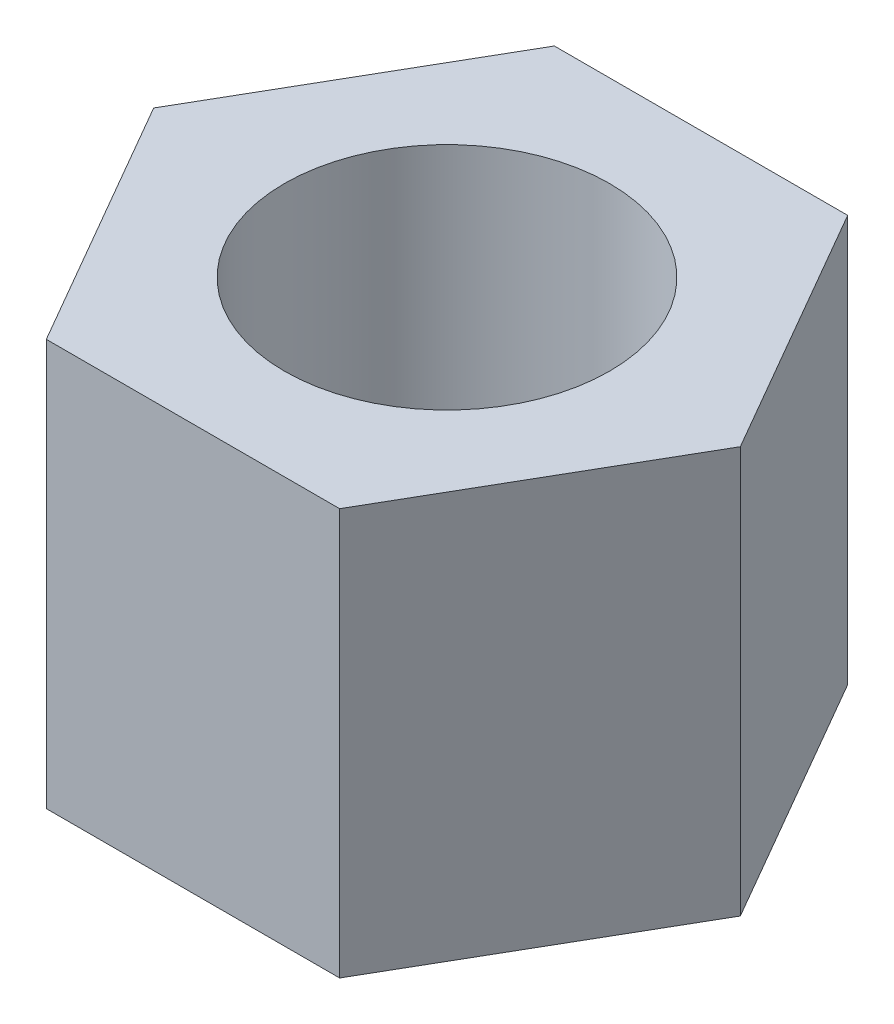
ISO-10303-21;
HEADER;
FILE_DESCRIPTION(('STEP AP214'),'2;1');
FILE_NAME('part.step','',(''),(''),'','','');
FILE_SCHEMA(('AUTOMOTIVE_DESIGN { 1 0 10303 214 1 1 1 1 }'));
ENDSEC;
DATA;
#1=APPLICATION_CONTEXT('core data for automotive mechanical design processes');
#2=APPLICATION_PROTOCOL_DEFINITION('international standard','automotive_design',2000,#1);
#3=PRODUCT_CONTEXT('',#1,'mechanical');
#4=PRODUCT('Part','Part','',(#3));
#5=PRODUCT_RELATED_PRODUCT_CATEGORY('part','',(#4));
#6=PRODUCT_DEFINITION_FORMATION('','',#4);
#7=PRODUCT_DEFINITION_CONTEXT('part definition',#1,'design');
#8=PRODUCT_DEFINITION('design','',#6,#7);
#9=PRODUCT_DEFINITION_SHAPE('','',#8);
#10=(LENGTH_UNIT() NAMED_UNIT(*) SI_UNIT(.MILLI.,.METRE.));
#11=(NAMED_UNIT(*) PLANE_ANGLE_UNIT() SI_UNIT($,.RADIAN.));
#12=(NAMED_UNIT(*) SI_UNIT($,.STERADIAN.) SOLID_ANGLE_UNIT());
#13=UNCERTAINTY_MEASURE_WITH_UNIT(LENGTH_MEASURE(1.E-05),#10,'distance_accuracy_value','');
#14=(GEOMETRIC_REPRESENTATION_CONTEXT(3) GLOBAL_UNCERTAINTY_ASSIGNED_CONTEXT((#13)) GLOBAL_UNIT_ASSIGNED_CONTEXT((#10,
#11,#12)) REPRESENTATION_CONTEXT('',''));
#15=CARTESIAN_POINT('',(0.,0.,0.));
#16=DIRECTION('',(0.,0.,1.));
#17=DIRECTION('',(1.,0.,0.));
#18=AXIS2_PLACEMENT_3D('',#15,#16,#17);
#19=CARTESIAN_POINT('',(0.,2.,0.));
#20=DIRECTION('',(0.,1.,0.));
#21=DIRECTION('',(0.,0.,1.));
#22=AXIS2_PLACEMENT_3D('',#19,#20,#21);
#23=PLANE('',#22);
#24=DIRECTION('',(0.5,0.,-0.866025403784439));
#25=VECTOR('',#24,1.);
#26=CARTESIAN_POINT('',(1.44337567297407,2.,2.5));
#27=LINE('',#26,#25);
#28=CARTESIAN_POINT('',(1.44337567297407,2.,2.5));
#29=VERTEX_POINT('',#28);
#30=CARTESIAN_POINT('',(2.88675134594813,2.,0.));
#31=VERTEX_POINT('',#30);
#32=EDGE_CURVE('E134',#29,#31,#27,.T.);
#33=ORIENTED_EDGE('',*,*,#32,.T.);
#34=DIRECTION('',(-0.5,0.,-0.866025403784438));
#35=VECTOR('',#34,1.);
#36=CARTESIAN_POINT('',(2.88675134594813,2.,0.));
#37=LINE('',#36,#35);
#38=CARTESIAN_POINT('',(1.44337567297406,2.,-2.5));
#39=VERTEX_POINT('',#38);
#40=EDGE_CURVE('E92',#31,#39,#37,.T.);
#41=ORIENTED_EDGE('',*,*,#40,.T.);
#42=DIRECTION('',(-1.,0.,0.));
#43=VECTOR('',#42,1.);
#44=CARTESIAN_POINT('',(1.44337567297406,2.,-2.5));
#45=LINE('',#44,#43);
#46=CARTESIAN_POINT('',(-1.44337567297406,2.,-2.5));
#47=VERTEX_POINT('',#46);
#48=EDGE_CURVE('E105',#39,#47,#45,.T.);
#49=ORIENTED_EDGE('',*,*,#48,.T.);
#50=DIRECTION('',(-0.5,0.,0.866025403784439));
#51=VECTOR('',#50,1.);
#52=CARTESIAN_POINT('',(-1.44337567297406,2.,-2.5));
#53=LINE('',#52,#51);
#54=CARTESIAN_POINT('',(-2.88675134594813,2.,0.));
#55=VERTEX_POINT('',#54);
#56=EDGE_CURVE('E99',#47,#55,#53,.T.);
#57=ORIENTED_EDGE('',*,*,#56,.T.);
#58=DIRECTION('',(0.5,0.,0.866025403784439));
#59=VECTOR('',#58,1.);
#60=CARTESIAN_POINT('',(-2.88675134594813,2.,0.));
#61=LINE('',#60,#59);
#62=CARTESIAN_POINT('',(-1.44337567297406,2.,2.5));
#63=VERTEX_POINT('',#62);
#64=EDGE_CURVE('E103',#55,#63,#61,.T.);
#65=ORIENTED_EDGE('',*,*,#64,.T.);
#66=DIRECTION('',(1.,0.,0.));
#67=VECTOR('',#66,1.);
#68=CARTESIAN_POINT('',(-1.44337567297406,2.,2.5));
#69=LINE('',#68,#67);
#70=EDGE_CURVE('E55',#63,#29,#69,.T.);
#71=ORIENTED_EDGE('',*,*,#70,.T.);
#72=EDGE_LOOP('',(#33,#41,#49,#57,#65,#71));
#73=FACE_BOUND('',#72,.T.);
#74=CARTESIAN_POINT('',(0.,2.,0.));
#75=DIRECTION('',(0.,1.,0.));
#76=DIRECTION('',(0.,0.,1.));
#77=AXIS2_PLACEMENT_3D('',#74,#75,#76);
#78=CIRCLE('',#77,1.6);
#79=CARTESIAN_POINT('',(0.,2.,1.6));
#80=VERTEX_POINT('',#79);
#81=EDGE_CURVE('E127',#80,#80,#78,.T.);
#82=ORIENTED_EDGE('',*,*,#81,.F.);
#83=EDGE_LOOP('',(#82));
#84=FACE_BOUND('',#83,.T.);
#85=ADVANCED_FACE('F38',(#73,#84),#23,.T.);
#86=CARTESIAN_POINT('',(0.,-2.,0.));
#87=DIRECTION('',(0.,1.,0.));
#88=DIRECTION('',(0.,0.,1.));
#89=AXIS2_PLACEMENT_3D('',#86,#87,#88);
#90=PLANE('',#89);
#91=DIRECTION('',(0.5,0.,-0.866025403784439));
#92=VECTOR('',#91,1.);
#93=CARTESIAN_POINT('',(1.44337567297407,-2.,2.5));
#94=LINE('',#93,#92);
#95=CARTESIAN_POINT('',(1.44337567297407,-2.,2.5));
#96=VERTEX_POINT('',#95);
#97=CARTESIAN_POINT('',(2.88675134594813,-2.,0.));
#98=VERTEX_POINT('',#97);
#99=EDGE_CURVE('E123',#96,#98,#94,.T.);
#100=ORIENTED_EDGE('',*,*,#99,.F.);
#101=DIRECTION('',(1.,0.,0.));
#102=VECTOR('',#101,1.);
#103=CARTESIAN_POINT('',(-1.44337567297406,-2.,2.5));
#104=LINE('',#103,#102);
#105=CARTESIAN_POINT('',(-1.44337567297406,-2.,2.5));
#106=VERTEX_POINT('',#105);
#107=EDGE_CURVE('E84',#106,#96,#104,.T.);
#108=ORIENTED_EDGE('',*,*,#107,.F.);
#109=DIRECTION('',(0.5,0.,0.866025403784439));
#110=VECTOR('',#109,1.);
#111=CARTESIAN_POINT('',(-2.88675134594813,-2.,0.));
#112=LINE('',#111,#110);
#113=CARTESIAN_POINT('',(-2.88675134594813,-2.,0.));
#114=VERTEX_POINT('',#113);
#115=EDGE_CURVE('E78',#114,#106,#112,.T.);
#116=ORIENTED_EDGE('',*,*,#115,.F.);
#117=DIRECTION('',(-0.5,0.,0.866025403784439));
#118=VECTOR('',#117,1.);
#119=CARTESIAN_POINT('',(-1.44337567297406,-2.,-2.5));
#120=LINE('',#119,#118);
#121=CARTESIAN_POINT('',(-1.44337567297406,-2.,-2.5));
#122=VERTEX_POINT('',#121);
#123=EDGE_CURVE('E113',#122,#114,#120,.T.);
#124=ORIENTED_EDGE('',*,*,#123,.F.);
#125=DIRECTION('',(-1.,0.,0.));
#126=VECTOR('',#125,1.);
#127=CARTESIAN_POINT('',(1.44337567297406,-2.,-2.5));
#128=LINE('',#127,#126);
#129=CARTESIAN_POINT('',(1.44337567297406,-2.,-2.5));
#130=VERTEX_POINT('',#129);
#131=EDGE_CURVE('E129',#130,#122,#128,.T.);
#132=ORIENTED_EDGE('',*,*,#131,.F.);
#133=DIRECTION('',(-0.5,0.,-0.866025403784438));
#134=VECTOR('',#133,1.);
#135=CARTESIAN_POINT('',(2.88675134594813,-2.,0.));
#136=LINE('',#135,#134);
#137=EDGE_CURVE('E126',#98,#130,#136,.T.);
#138=ORIENTED_EDGE('',*,*,#137,.F.);
#139=EDGE_LOOP('',(#100,#108,#116,#124,#132,#138));
#140=FACE_BOUND('',#139,.T.);
#141=CARTESIAN_POINT('',(0.,-2.,0.));
#142=DIRECTION('',(0.,1.,0.));
#143=DIRECTION('',(0.,0.,1.));
#144=AXIS2_PLACEMENT_3D('',#141,#142,#143);
#145=CIRCLE('',#144,1.6);
#146=CARTESIAN_POINT('',(0.,-2.,1.6));
#147=VERTEX_POINT('',#146);
#148=EDGE_CURVE('E245',#147,#147,#145,.T.);
#149=ORIENTED_EDGE('',*,*,#148,.T.);
#150=EDGE_LOOP('',(#149));
#151=FACE_BOUND('',#150,.T.);
#152=ADVANCED_FACE('F143',(#140,#151),#90,.F.);
#153=CARTESIAN_POINT('',(1.44337567297407,2.,2.5));
#154=DIRECTION('',(-0.866025403784439,0.,-0.5));
#155=DIRECTION('',(-0.5,0.,0.866025403784439));
#156=AXIS2_PLACEMENT_3D('',#153,#154,#155);
#157=PLANE('',#156);
#158=ORIENTED_EDGE('',*,*,#99,.T.);
#159=DIRECTION('',(0.,-1.,0.));
#160=VECTOR('',#159,1.);
#161=CARTESIAN_POINT('',(2.88675134594813,2.,0.));
#162=LINE('',#161,#160);
#163=EDGE_CURVE('E11',#31,#98,#162,.T.);
#164=ORIENTED_EDGE('',*,*,#163,.F.);
#165=ORIENTED_EDGE('',*,*,#32,.F.);
#166=DIRECTION('',(0.,-1.,0.));
#167=VECTOR('',#166,1.);
#168=CARTESIAN_POINT('',(1.44337567297407,2.,2.5));
#169=LINE('',#168,#167);
#170=EDGE_CURVE('E119',#29,#96,#169,.T.);
#171=ORIENTED_EDGE('',*,*,#170,.T.);
#172=EDGE_LOOP('',(#158,#164,#165,#171));
#173=FACE_BOUND('',#172,.T.);
#174=ADVANCED_FACE('F40',(#173),#157,.F.);
#175=CARTESIAN_POINT('',(2.88675134594813,2.,0.));
#176=DIRECTION('',(-0.866025403784438,0.,0.5));
#177=DIRECTION('',(0.5,0.,0.866025403784438));
#178=AXIS2_PLACEMENT_3D('',#175,#176,#177);
#179=PLANE('',#178);
#180=ORIENTED_EDGE('',*,*,#137,.T.);
#181=DIRECTION('',(0.,-1.,0.));
#182=VECTOR('',#181,1.);
#183=CARTESIAN_POINT('',(1.44337567297406,2.,-2.5));
#184=LINE('',#183,#182);
#185=EDGE_CURVE('E47',#39,#130,#184,.T.);
#186=ORIENTED_EDGE('',*,*,#185,.F.);
#187=ORIENTED_EDGE('',*,*,#40,.F.);
#188=ORIENTED_EDGE('',*,*,#163,.T.);
#189=EDGE_LOOP('',(#180,#186,#187,#188));
#190=FACE_BOUND('',#189,.T.);
#191=ADVANCED_FACE('F168',(#190),#179,.F.);
#192=CARTESIAN_POINT('',(1.44337567297406,2.,-2.5));
#193=DIRECTION('',(0.,0.,1.));
#194=DIRECTION('',(1.,0.,0.));
#195=AXIS2_PLACEMENT_3D('',#192,#193,#194);
#196=PLANE('',#195);
#197=ORIENTED_EDGE('',*,*,#131,.T.);
#198=DIRECTION('',(0.,-1.,0.));
#199=VECTOR('',#198,1.);
#200=CARTESIAN_POINT('',(-1.44337567297406,2.,-2.5));
#201=LINE('',#200,#199);
#202=EDGE_CURVE('E114',#47,#122,#201,.T.);
#203=ORIENTED_EDGE('',*,*,#202,.F.);
#204=ORIENTED_EDGE('',*,*,#48,.F.);
#205=ORIENTED_EDGE('',*,*,#185,.T.);
#206=EDGE_LOOP('',(#197,#203,#204,#205));
#207=FACE_BOUND('',#206,.T.);
#208=ADVANCED_FACE('F140',(#207),#196,.F.);
#209=CARTESIAN_POINT('',(-1.44337567297406,2.,-2.5));
#210=DIRECTION('',(0.866025403784439,0.,0.5));
#211=DIRECTION('',(0.5,0.,-0.866025403784439));
#212=AXIS2_PLACEMENT_3D('',#209,#210,#211);
#213=PLANE('',#212);
#214=ORIENTED_EDGE('',*,*,#123,.T.);
#215=DIRECTION('',(0.,-1.,0.));
#216=VECTOR('',#215,1.);
#217=CARTESIAN_POINT('',(-2.88675134594813,2.,0.));
#218=LINE('',#217,#216);
#219=EDGE_CURVE('E110',#55,#114,#218,.T.);
#220=ORIENTED_EDGE('',*,*,#219,.F.);
#221=ORIENTED_EDGE('',*,*,#56,.F.);
#222=ORIENTED_EDGE('',*,*,#202,.T.);
#223=EDGE_LOOP('',(#214,#220,#221,#222));
#224=FACE_BOUND('',#223,.T.);
#225=ADVANCED_FACE('F111',(#224),#213,.F.);
#226=CARTESIAN_POINT('',(-2.88675134594813,2.,0.));
#227=DIRECTION('',(0.866025403784439,0.,-0.5));
#228=DIRECTION('',(-0.5,0.,-0.866025403784439));
#229=AXIS2_PLACEMENT_3D('',#226,#227,#228);
#230=PLANE('',#229);
#231=ORIENTED_EDGE('',*,*,#115,.T.);
#232=DIRECTION('',(0.,-1.,0.));
#233=VECTOR('',#232,1.);
#234=CARTESIAN_POINT('',(-1.44337567297406,2.,2.5));
#235=LINE('',#234,#233);
#236=EDGE_CURVE('E115',#63,#106,#235,.T.);
#237=ORIENTED_EDGE('',*,*,#236,.F.);
#238=ORIENTED_EDGE('',*,*,#64,.F.);
#239=ORIENTED_EDGE('',*,*,#219,.T.);
#240=EDGE_LOOP('',(#231,#237,#238,#239));
#241=FACE_BOUND('',#240,.T.);
#242=ADVANCED_FACE('F117',(#241),#230,.F.);
#243=CARTESIAN_POINT('',(-1.44337567297406,2.,2.5));
#244=DIRECTION('',(0.,0.,-1.));
#245=DIRECTION('',(-1.,0.,0.));
#246=AXIS2_PLACEMENT_3D('',#243,#244,#245);
#247=PLANE('',#246);
#248=ORIENTED_EDGE('',*,*,#107,.T.);
#249=ORIENTED_EDGE('',*,*,#170,.F.);
#250=ORIENTED_EDGE('',*,*,#70,.F.);
#251=ORIENTED_EDGE('',*,*,#236,.T.);
#252=EDGE_LOOP('',(#248,#249,#250,#251));
#253=FACE_BOUND('',#252,.T.);
#254=ADVANCED_FACE('F148',(#253),#247,.F.);
#255=CARTESIAN_POINT('',(0.,2.,0.));
#256=DIRECTION('',(0.,-1.,0.));
#257=DIRECTION('',(0.,0.,-1.));
#258=AXIS2_PLACEMENT_3D('',#255,#256,#257);
#259=CYLINDRICAL_SURFACE('',#258,1.6);
#260=ORIENTED_EDGE('',*,*,#81,.T.);
#261=EDGE_LOOP('',(#260));
#262=FACE_BOUND('',#261,.T.);
#263=ORIENTED_EDGE('',*,*,#148,.F.);
#264=EDGE_LOOP('',(#263));
#265=FACE_BOUND('',#264,.T.);
#266=ADVANCED_FACE('F150',(#262,#265),#259,.F.);
#267=CLOSED_SHELL('',(#85,#152,#174,#191,#208,#225,#242,#254,#266));
#268=MANIFOLD_SOLID_BREP('B2',#267);
#269=ADVANCED_BREP_SHAPE_REPRESENTATION('',(#18,#268),#14);
#270=SHAPE_DEFINITION_REPRESENTATION(#9,#269);
ENDSEC;
END-ISO-10303-21;
